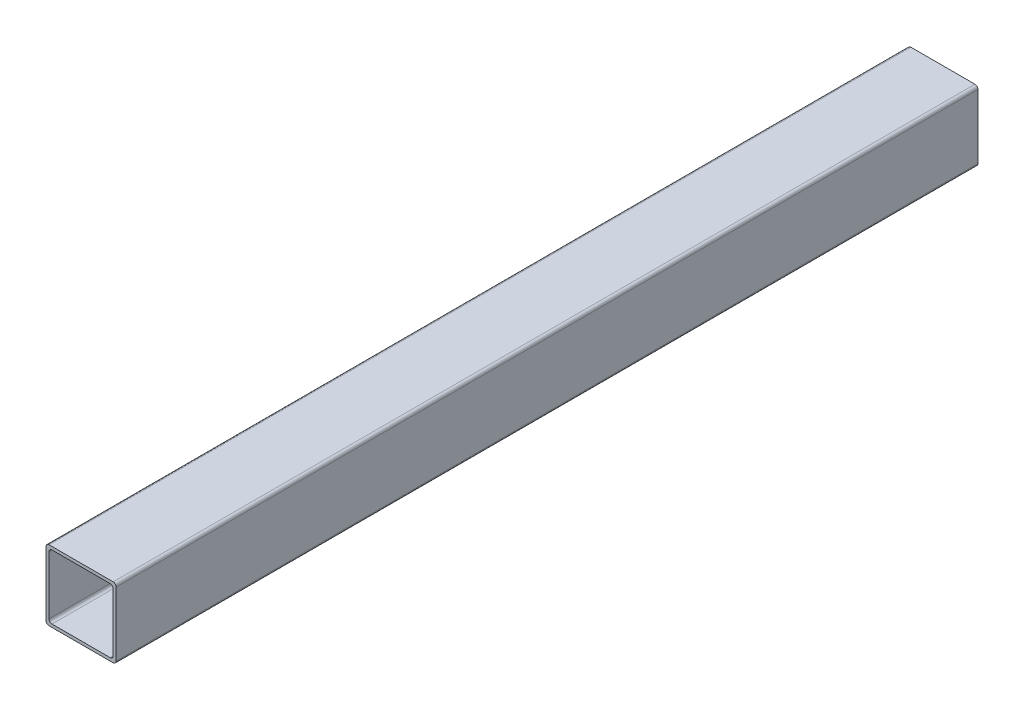
ISO-10303-21;
HEADER;
FILE_DESCRIPTION(('STEP AP214'),'2;1');
FILE_NAME('part.step','',(''),(''),'','','');
FILE_SCHEMA(('AUTOMOTIVE_DESIGN { 1 0 10303 214 1 1 1 1 }'));
ENDSEC;
DATA;
#1=APPLICATION_CONTEXT('core data for automotive mechanical design processes');
#2=APPLICATION_PROTOCOL_DEFINITION('international standard','automotive_design',2000,#1);
#3=PRODUCT_CONTEXT('',#1,'mechanical');
#4=PRODUCT('Part','Part','',(#3));
#5=PRODUCT_RELATED_PRODUCT_CATEGORY('part','',(#4));
#6=PRODUCT_DEFINITION_FORMATION('','',#4);
#7=PRODUCT_DEFINITION_CONTEXT('part definition',#1,'design');
#8=PRODUCT_DEFINITION('design','',#6,#7);
#9=PRODUCT_DEFINITION_SHAPE('','',#8);
#10=(LENGTH_UNIT() NAMED_UNIT(*) SI_UNIT(.MILLI.,.METRE.));
#11=(NAMED_UNIT(*) PLANE_ANGLE_UNIT() SI_UNIT($,.RADIAN.));
#12=(NAMED_UNIT(*) SI_UNIT($,.STERADIAN.) SOLID_ANGLE_UNIT());
#13=UNCERTAINTY_MEASURE_WITH_UNIT(LENGTH_MEASURE(1.E-05),#10,'distance_accuracy_value','');
#14=(GEOMETRIC_REPRESENTATION_CONTEXT(3) GLOBAL_UNCERTAINTY_ASSIGNED_CONTEXT((#13)) GLOBAL_UNIT_ASSIGNED_CONTEXT((#10,
#11,#12)) REPRESENTATION_CONTEXT('',''));
#15=CARTESIAN_POINT('',(0.,0.,0.));
#16=DIRECTION('',(0.,0.,1.));
#17=DIRECTION('',(1.,0.,0.));
#18=AXIS2_PLACEMENT_3D('',#15,#16,#17);
#19=CARTESIAN_POINT('',(0.,0.,860.));
#20=DIRECTION('',(0.,0.,-1.));
#21=DIRECTION('',(-1.,0.,0.));
#22=AXIS2_PLACEMENT_3D('',#19,#20,#21);
#23=PLANE('',#22);
#24=DIRECTION('',(1.,0.,0.));
#25=VECTOR('',#24,1.);
#26=CARTESIAN_POINT('',(0.,0.,860.));
#27=LINE('',#26,#25);
#28=CARTESIAN_POINT('',(3.,0.,860.));
#29=VERTEX_POINT('',#28);
#30=CARTESIAN_POINT('',(67.,0.,860.));
#31=VERTEX_POINT('',#30);
#32=EDGE_CURVE('E282',#29,#31,#27,.T.);
#33=ORIENTED_EDGE('',*,*,#32,.T.);
#34=CARTESIAN_POINT('',(67.,3.,860.));
#35=DIRECTION('',(0.,0.,-1.));
#36=DIRECTION('',(-1.,0.,0.));
#37=AXIS2_PLACEMENT_3D('',#34,#35,#36);
#38=CIRCLE('',#37,3.);
#39=CARTESIAN_POINT('',(70.,3.,860.));
#40=VERTEX_POINT('',#39);
#41=EDGE_CURVE('E203',#31,#40,#38,.F.);
#42=ORIENTED_EDGE('',*,*,#41,.T.);
#43=DIRECTION('',(0.,1.,0.));
#44=VECTOR('',#43,1.);
#45=CARTESIAN_POINT('',(70.,0.,860.));
#46=LINE('',#45,#44);
#47=CARTESIAN_POINT('',(70.,67.,860.));
#48=VERTEX_POINT('',#47);
#49=EDGE_CURVE('E171',#40,#48,#46,.T.);
#50=ORIENTED_EDGE('',*,*,#49,.T.);
#51=CARTESIAN_POINT('',(67.,67.,860.));
#52=DIRECTION('',(0.,0.,-1.));
#53=DIRECTION('',(-1.,0.,0.));
#54=AXIS2_PLACEMENT_3D('',#51,#52,#53);
#55=CIRCLE('',#54,3.);
#56=CARTESIAN_POINT('',(67.,70.,860.));
#57=VERTEX_POINT('',#56);
#58=EDGE_CURVE('E201',#48,#57,#55,.F.);
#59=ORIENTED_EDGE('',*,*,#58,.T.);
#60=DIRECTION('',(-1.,0.,0.));
#61=VECTOR('',#60,1.);
#62=CARTESIAN_POINT('',(0.,70.,860.));
#63=LINE('',#62,#61);
#64=CARTESIAN_POINT('',(3.,70.,860.));
#65=VERTEX_POINT('',#64);
#66=EDGE_CURVE('E188',#57,#65,#63,.T.);
#67=ORIENTED_EDGE('',*,*,#66,.T.);
#68=CARTESIAN_POINT('',(3.,67.,860.));
#69=DIRECTION('',(0.,0.,-1.));
#70=DIRECTION('',(-1.,0.,0.));
#71=AXIS2_PLACEMENT_3D('',#68,#69,#70);
#72=CIRCLE('',#71,3.);
#73=CARTESIAN_POINT('',(0.,67.,860.));
#74=VERTEX_POINT('',#73);
#75=EDGE_CURVE('E199',#65,#74,#72,.F.);
#76=ORIENTED_EDGE('',*,*,#75,.T.);
#77=DIRECTION('',(0.,-1.,0.));
#78=VECTOR('',#77,1.);
#79=CARTESIAN_POINT('',(0.,0.,860.));
#80=LINE('',#79,#78);
#81=CARTESIAN_POINT('',(0.,3.,860.));
#82=VERTEX_POINT('',#81);
#83=EDGE_CURVE('E182',#74,#82,#80,.T.);
#84=ORIENTED_EDGE('',*,*,#83,.T.);
#85=CARTESIAN_POINT('',(3.,3.,860.));
#86=DIRECTION('',(0.,0.,-1.));
#87=DIRECTION('',(-1.,0.,0.));
#88=AXIS2_PLACEMENT_3D('',#85,#86,#87);
#89=CIRCLE('',#88,3.);
#90=EDGE_CURVE('E197',#82,#29,#89,.F.);
#91=ORIENTED_EDGE('',*,*,#90,.T.);
#92=EDGE_LOOP('',(#33,#42,#50,#59,#67,#76,#84,#91));
#93=FACE_BOUND('',#92,.T.);
#94=DIRECTION('',(0.,-1.,0.));
#95=VECTOR('',#94,1.);
#96=CARTESIAN_POINT('',(3.,3.,860.));
#97=LINE('',#96,#95);
#98=CARTESIAN_POINT('',(3.,64.,860.));
#99=VERTEX_POINT('',#98);
#100=CARTESIAN_POINT('',(3.,6.,860.));
#101=VERTEX_POINT('',#100);
#102=EDGE_CURVE('E260',#99,#101,#97,.T.);
#103=ORIENTED_EDGE('',*,*,#102,.F.);
#104=CARTESIAN_POINT('',(6.,64.,860.));
#105=DIRECTION('',(0.,0.,-1.));
#106=DIRECTION('',(-1.,0.,0.));
#107=AXIS2_PLACEMENT_3D('',#104,#105,#106);
#108=CIRCLE('',#107,3.);
#109=CARTESIAN_POINT('',(6.,67.,860.));
#110=VERTEX_POINT('',#109);
#111=EDGE_CURVE('E243',#99,#110,#108,.T.);
#112=ORIENTED_EDGE('',*,*,#111,.T.);
#113=DIRECTION('',(-1.,0.,0.));
#114=VECTOR('',#113,1.);
#115=CARTESIAN_POINT('',(3.,67.,860.));
#116=LINE('',#115,#114);
#117=CARTESIAN_POINT('',(64.,67.,860.));
#118=VERTEX_POINT('',#117);
#119=EDGE_CURVE('E275',#118,#110,#116,.T.);
#120=ORIENTED_EDGE('',*,*,#119,.F.);
#121=CARTESIAN_POINT('',(64.,64.,860.));
#122=DIRECTION('',(0.,0.,-1.));
#123=DIRECTION('',(-1.,0.,0.));
#124=AXIS2_PLACEMENT_3D('',#121,#122,#123);
#125=CIRCLE('',#124,3.);
#126=CARTESIAN_POINT('',(67.,64.,860.));
#127=VERTEX_POINT('',#126);
#128=EDGE_CURVE('E239',#118,#127,#125,.T.);
#129=ORIENTED_EDGE('',*,*,#128,.T.);
#130=DIRECTION('',(0.,1.,0.));
#131=VECTOR('',#130,1.);
#132=CARTESIAN_POINT('',(67.,3.,860.));
#133=LINE('',#132,#131);
#134=CARTESIAN_POINT('',(67.,6.,860.));
#135=VERTEX_POINT('',#134);
#136=EDGE_CURVE('E268',#135,#127,#133,.T.);
#137=ORIENTED_EDGE('',*,*,#136,.F.);
#138=CARTESIAN_POINT('',(64.,6.,860.));
#139=DIRECTION('',(0.,0.,-1.));
#140=DIRECTION('',(-1.,0.,0.));
#141=AXIS2_PLACEMENT_3D('',#138,#139,#140);
#142=CIRCLE('',#141,3.);
#143=CARTESIAN_POINT('',(64.,3.,860.));
#144=VERTEX_POINT('',#143);
#145=EDGE_CURVE('E52',#135,#144,#142,.T.);
#146=ORIENTED_EDGE('',*,*,#145,.T.);
#147=DIRECTION('',(1.,0.,0.));
#148=VECTOR('',#147,1.);
#149=CARTESIAN_POINT('',(3.,3.,860.));
#150=LINE('',#149,#148);
#151=CARTESIAN_POINT('',(6.,3.,860.));
#152=VERTEX_POINT('',#151);
#153=EDGE_CURVE('E262',#152,#144,#150,.T.);
#154=ORIENTED_EDGE('',*,*,#153,.F.);
#155=CARTESIAN_POINT('',(6.,6.,860.));
#156=DIRECTION('',(0.,0.,-1.));
#157=DIRECTION('',(-1.,0.,0.));
#158=AXIS2_PLACEMENT_3D('',#155,#156,#157);
#159=CIRCLE('',#158,3.);
#160=EDGE_CURVE('E11',#152,#101,#159,.T.);
#161=ORIENTED_EDGE('',*,*,#160,.T.);
#162=EDGE_LOOP('',(#103,#112,#120,#129,#137,#146,#154,#161));
#163=FACE_BOUND('',#162,.T.);
#164=ADVANCED_FACE('F37',(#93,#163),#23,.F.);
#165=CARTESIAN_POINT('',(0.,0.,0.));
#166=DIRECTION('',(0.,0.,-1.));
#167=DIRECTION('',(-1.,0.,0.));
#168=AXIS2_PLACEMENT_3D('',#165,#166,#167);
#169=PLANE('',#168);
#170=DIRECTION('',(0.,1.,0.));
#171=VECTOR('',#170,1.);
#172=CARTESIAN_POINT('',(70.,0.,0.));
#173=LINE('',#172,#171);
#174=CARTESIAN_POINT('',(70.,3.,0.));
#175=VERTEX_POINT('',#174);
#176=CARTESIAN_POINT('',(70.,67.,0.));
#177=VERTEX_POINT('',#176);
#178=EDGE_CURVE('E168',#175,#177,#173,.T.);
#179=ORIENTED_EDGE('',*,*,#178,.F.);
#180=CARTESIAN_POINT('',(67.,3.,0.));
#181=DIRECTION('',(0.,0.,-1.));
#182=DIRECTION('',(-1.,0.,0.));
#183=AXIS2_PLACEMENT_3D('',#180,#181,#182);
#184=CIRCLE('',#183,3.);
#185=CARTESIAN_POINT('',(67.,0.,0.));
#186=VERTEX_POINT('',#185);
#187=EDGE_CURVE('E151',#175,#186,#184,.T.);
#188=ORIENTED_EDGE('',*,*,#187,.T.);
#189=DIRECTION('',(1.,0.,0.));
#190=VECTOR('',#189,1.);
#191=CARTESIAN_POINT('',(0.,0.,0.));
#192=LINE('',#191,#190);
#193=CARTESIAN_POINT('',(3.,0.,0.));
#194=VERTEX_POINT('',#193);
#195=EDGE_CURVE('E179',#194,#186,#192,.T.);
#196=ORIENTED_EDGE('',*,*,#195,.F.);
#197=CARTESIAN_POINT('',(3.,3.,0.));
#198=DIRECTION('',(0.,0.,-1.));
#199=DIRECTION('',(-1.,0.,0.));
#200=AXIS2_PLACEMENT_3D('',#197,#198,#199);
#201=CIRCLE('',#200,3.);
#202=CARTESIAN_POINT('',(0.,3.,0.));
#203=VERTEX_POINT('',#202);
#204=EDGE_CURVE('E172',#194,#203,#201,.T.);
#205=ORIENTED_EDGE('',*,*,#204,.T.);
#206=DIRECTION('',(0.,-1.,0.));
#207=VECTOR('',#206,1.);
#208=CARTESIAN_POINT('',(0.,0.,0.));
#209=LINE('',#208,#207);
#210=CARTESIAN_POINT('',(0.,67.,0.));
#211=VERTEX_POINT('',#210);
#212=EDGE_CURVE('E184',#211,#203,#209,.T.);
#213=ORIENTED_EDGE('',*,*,#212,.F.);
#214=CARTESIAN_POINT('',(3.,67.,0.));
#215=DIRECTION('',(0.,0.,-1.));
#216=DIRECTION('',(-1.,0.,0.));
#217=AXIS2_PLACEMENT_3D('',#214,#215,#216);
#218=CIRCLE('',#217,3.);
#219=CARTESIAN_POINT('',(3.,70.,0.));
#220=VERTEX_POINT('',#219);
#221=EDGE_CURVE('E191',#211,#220,#218,.T.);
#222=ORIENTED_EDGE('',*,*,#221,.T.);
#223=DIRECTION('',(-1.,0.,0.));
#224=VECTOR('',#223,1.);
#225=CARTESIAN_POINT('',(0.,70.,0.));
#226=LINE('',#225,#224);
#227=CARTESIAN_POINT('',(67.,70.,0.));
#228=VERTEX_POINT('',#227);
#229=EDGE_CURVE('E178',#228,#220,#226,.T.);
#230=ORIENTED_EDGE('',*,*,#229,.F.);
#231=CARTESIAN_POINT('',(67.,67.,0.));
#232=DIRECTION('',(0.,0.,-1.));
#233=DIRECTION('',(-1.,0.,0.));
#234=AXIS2_PLACEMENT_3D('',#231,#232,#233);
#235=CIRCLE('',#234,3.);
#236=EDGE_CURVE('E162',#228,#177,#235,.T.);
#237=ORIENTED_EDGE('',*,*,#236,.T.);
#238=EDGE_LOOP('',(#179,#188,#196,#205,#213,#222,#230,#237));
#239=FACE_BOUND('',#238,.T.);
#240=DIRECTION('',(0.,1.,0.));
#241=VECTOR('',#240,1.);
#242=CARTESIAN_POINT('',(67.,3.,0.));
#243=LINE('',#242,#241);
#244=CARTESIAN_POINT('',(67.,6.,0.));
#245=VERTEX_POINT('',#244);
#246=CARTESIAN_POINT('',(67.,64.,0.));
#247=VERTEX_POINT('',#246);
#248=EDGE_CURVE('E254',#245,#247,#243,.T.);
#249=ORIENTED_EDGE('',*,*,#248,.T.);
#250=CARTESIAN_POINT('',(64.,64.,0.));
#251=DIRECTION('',(0.,0.,-1.));
#252=DIRECTION('',(-1.,0.,0.));
#253=AXIS2_PLACEMENT_3D('',#250,#251,#252);
#254=CIRCLE('',#253,3.);
#255=CARTESIAN_POINT('',(64.,67.,0.));
#256=VERTEX_POINT('',#255);
#257=EDGE_CURVE('E237',#247,#256,#254,.F.);
#258=ORIENTED_EDGE('',*,*,#257,.T.);
#259=DIRECTION('',(-1.,0.,0.));
#260=VECTOR('',#259,1.);
#261=CARTESIAN_POINT('',(3.,67.,0.));
#262=LINE('',#261,#260);
#263=CARTESIAN_POINT('',(6.,67.,0.));
#264=VERTEX_POINT('',#263);
#265=EDGE_CURVE('E266',#256,#264,#262,.T.);
#266=ORIENTED_EDGE('',*,*,#265,.T.);
#267=CARTESIAN_POINT('',(6.,64.,0.));
#268=DIRECTION('',(0.,0.,-1.));
#269=DIRECTION('',(-1.,0.,0.));
#270=AXIS2_PLACEMENT_3D('',#267,#268,#269);
#271=CIRCLE('',#270,3.);
#272=CARTESIAN_POINT('',(3.,64.,0.));
#273=VERTEX_POINT('',#272);
#274=EDGE_CURVE('E241',#264,#273,#271,.F.);
#275=ORIENTED_EDGE('',*,*,#274,.T.);
#276=DIRECTION('',(0.,-1.,0.));
#277=VECTOR('',#276,1.);
#278=CARTESIAN_POINT('',(3.,3.,0.));
#279=LINE('',#278,#277);
#280=CARTESIAN_POINT('',(3.,6.,0.));
#281=VERTEX_POINT('',#280);
#282=EDGE_CURVE('E249',#273,#281,#279,.T.);
#283=ORIENTED_EDGE('',*,*,#282,.T.);
#284=CARTESIAN_POINT('',(6.,6.,0.));
#285=DIRECTION('',(0.,0.,-1.));
#286=DIRECTION('',(-1.,0.,0.));
#287=AXIS2_PLACEMENT_3D('',#284,#285,#286);
#288=CIRCLE('',#287,3.);
#289=CARTESIAN_POINT('',(6.,3.,0.));
#290=VERTEX_POINT('',#289);
#291=EDGE_CURVE('E45',#281,#290,#288,.F.);
#292=ORIENTED_EDGE('',*,*,#291,.T.);
#293=DIRECTION('',(1.,0.,0.));
#294=VECTOR('',#293,1.);
#295=CARTESIAN_POINT('',(3.,3.,0.));
#296=LINE('',#295,#294);
#297=CARTESIAN_POINT('',(64.,3.,0.));
#298=VERTEX_POINT('',#297);
#299=EDGE_CURVE('E247',#290,#298,#296,.T.);
#300=ORIENTED_EDGE('',*,*,#299,.T.);
#301=CARTESIAN_POINT('',(64.,6.,0.));
#302=DIRECTION('',(0.,0.,-1.));
#303=DIRECTION('',(-1.,0.,0.));
#304=AXIS2_PLACEMENT_3D('',#301,#302,#303);
#305=CIRCLE('',#304,3.);
#306=EDGE_CURVE('E234',#298,#245,#305,.F.);
#307=ORIENTED_EDGE('',*,*,#306,.T.);
#308=EDGE_LOOP('',(#249,#258,#266,#275,#283,#292,#300,#307));
#309=FACE_BOUND('',#308,.T.);
#310=ADVANCED_FACE('F175',(#239,#309),#169,.T.);
#311=CARTESIAN_POINT('',(0.,0.,860.));
#312=DIRECTION('',(1.,0.,0.));
#313=DIRECTION('',(0.,0.,-1.));
#314=AXIS2_PLACEMENT_3D('',#311,#312,#313);
#315=PLANE('',#314);
#316=ORIENTED_EDGE('',*,*,#83,.F.);
#317=DIRECTION('',(0.,0.,-1.));
#318=VECTOR('',#317,1.);
#319=CARTESIAN_POINT('',(0.,67.,860.));
#320=LINE('',#319,#318);
#321=EDGE_CURVE('E226',#74,#211,#320,.T.);
#322=ORIENTED_EDGE('',*,*,#321,.T.);
#323=ORIENTED_EDGE('',*,*,#212,.T.);
#324=DIRECTION('',(0.,0.,-1.));
#325=VECTOR('',#324,1.);
#326=CARTESIAN_POINT('',(0.,3.,860.));
#327=LINE('',#326,#325);
#328=EDGE_CURVE('E224',#203,#82,#327,.F.);
#329=ORIENTED_EDGE('',*,*,#328,.T.);
#330=EDGE_LOOP('',(#316,#322,#323,#329));
#331=FACE_BOUND('',#330,.T.);
#332=ADVANCED_FACE('F292',(#331),#315,.F.);
#333=CARTESIAN_POINT('',(0.,0.,860.));
#334=DIRECTION('',(0.,1.,0.));
#335=DIRECTION('',(0.,0.,1.));
#336=AXIS2_PLACEMENT_3D('',#333,#334,#335);
#337=PLANE('',#336);
#338=ORIENTED_EDGE('',*,*,#195,.T.);
#339=DIRECTION('',(0.,0.,-1.));
#340=VECTOR('',#339,1.);
#341=CARTESIAN_POINT('',(67.,0.,860.));
#342=LINE('',#341,#340);
#343=EDGE_CURVE('E156',#186,#31,#342,.F.);
#344=ORIENTED_EDGE('',*,*,#343,.T.);
#345=ORIENTED_EDGE('',*,*,#32,.F.);
#346=DIRECTION('',(0.,0.,-1.));
#347=VECTOR('',#346,1.);
#348=CARTESIAN_POINT('',(3.,0.,860.));
#349=LINE('',#348,#347);
#350=EDGE_CURVE('E161',#29,#194,#349,.T.);
#351=ORIENTED_EDGE('',*,*,#350,.T.);
#352=EDGE_LOOP('',(#338,#344,#345,#351));
#353=FACE_BOUND('',#352,.T.);
#354=ADVANCED_FACE('F300',(#353),#337,.F.);
#355=CARTESIAN_POINT('',(70.,0.,860.));
#356=DIRECTION('',(-1.,0.,0.));
#357=DIRECTION('',(0.,0.,1.));
#358=AXIS2_PLACEMENT_3D('',#355,#356,#357);
#359=PLANE('',#358);
#360=ORIENTED_EDGE('',*,*,#49,.F.);
#361=DIRECTION('',(0.,0.,-1.));
#362=VECTOR('',#361,1.);
#363=CARTESIAN_POINT('',(70.,3.,860.));
#364=LINE('',#363,#362);
#365=EDGE_CURVE('E155',#40,#175,#364,.T.);
#366=ORIENTED_EDGE('',*,*,#365,.T.);
#367=ORIENTED_EDGE('',*,*,#178,.T.);
#368=DIRECTION('',(0.,0.,-1.));
#369=VECTOR('',#368,1.);
#370=CARTESIAN_POINT('',(70.,67.,860.));
#371=LINE('',#370,#369);
#372=EDGE_CURVE('E173',#177,#48,#371,.F.);
#373=ORIENTED_EDGE('',*,*,#372,.T.);
#374=EDGE_LOOP('',(#360,#366,#367,#373));
#375=FACE_BOUND('',#374,.T.);
#376=ADVANCED_FACE('F167',(#375),#359,.F.);
#377=CARTESIAN_POINT('',(0.,70.,860.));
#378=DIRECTION('',(0.,-1.,0.));
#379=DIRECTION('',(0.,0.,-1.));
#380=AXIS2_PLACEMENT_3D('',#377,#378,#379);
#381=PLANE('',#380);
#382=ORIENTED_EDGE('',*,*,#66,.F.);
#383=DIRECTION('',(0.,0.,-1.));
#384=VECTOR('',#383,1.);
#385=CARTESIAN_POINT('',(67.,70.,860.));
#386=LINE('',#385,#384);
#387=EDGE_CURVE('E216',#57,#228,#386,.T.);
#388=ORIENTED_EDGE('',*,*,#387,.T.);
#389=ORIENTED_EDGE('',*,*,#229,.T.);
#390=DIRECTION('',(0.,0.,-1.));
#391=VECTOR('',#390,1.);
#392=CARTESIAN_POINT('',(3.,70.,860.));
#393=LINE('',#392,#391);
#394=EDGE_CURVE('E214',#220,#65,#393,.F.);
#395=ORIENTED_EDGE('',*,*,#394,.T.);
#396=EDGE_LOOP('',(#382,#388,#389,#395));
#397=FACE_BOUND('',#396,.T.);
#398=ADVANCED_FACE('F307',(#397),#381,.F.);
#399=CARTESIAN_POINT('',(3.,3.,860.));
#400=DIRECTION('',(1.,0.,0.));
#401=DIRECTION('',(0.,0.,-1.));
#402=AXIS2_PLACEMENT_3D('',#399,#400,#401);
#403=PLANE('',#402);
#404=ORIENTED_EDGE('',*,*,#282,.F.);
#405=DIRECTION('',(0.,0.,-1.));
#406=VECTOR('',#405,1.);
#407=CARTESIAN_POINT('',(3.,64.,860.));
#408=LINE('',#407,#406);
#409=EDGE_CURVE('E232',#273,#99,#408,.F.);
#410=ORIENTED_EDGE('',*,*,#409,.T.);
#411=ORIENTED_EDGE('',*,*,#102,.T.);
#412=DIRECTION('',(0.,0.,-1.));
#413=VECTOR('',#412,1.);
#414=CARTESIAN_POINT('',(3.,6.,0.));
#415=LINE('',#414,#413);
#416=EDGE_CURVE('E229',#101,#281,#415,.T.);
#417=ORIENTED_EDGE('',*,*,#416,.T.);
#418=EDGE_LOOP('',(#404,#410,#411,#417));
#419=FACE_BOUND('',#418,.T.);
#420=ADVANCED_FACE('F264',(#419),#403,.T.);
#421=CARTESIAN_POINT('',(3.,3.,860.));
#422=DIRECTION('',(0.,1.,0.));
#423=DIRECTION('',(0.,0.,1.));
#424=AXIS2_PLACEMENT_3D('',#421,#422,#423);
#425=PLANE('',#424);
#426=ORIENTED_EDGE('',*,*,#153,.T.);
#427=DIRECTION('',(0.,0.,-1.));
#428=VECTOR('',#427,1.);
#429=CARTESIAN_POINT('',(64.,3.,0.));
#430=LINE('',#429,#428);
#431=EDGE_CURVE('E206',#144,#298,#430,.T.);
#432=ORIENTED_EDGE('',*,*,#431,.T.);
#433=ORIENTED_EDGE('',*,*,#299,.F.);
#434=DIRECTION('',(0.,0.,-1.));
#435=VECTOR('',#434,1.);
#436=CARTESIAN_POINT('',(6.,3.,860.));
#437=LINE('',#436,#435);
#438=EDGE_CURVE('E59',#290,#152,#437,.F.);
#439=ORIENTED_EDGE('',*,*,#438,.T.);
#440=EDGE_LOOP('',(#426,#432,#433,#439));
#441=FACE_BOUND('',#440,.T.);
#442=ADVANCED_FACE('F252',(#441),#425,.T.);
#443=CARTESIAN_POINT('',(67.,3.,860.));
#444=DIRECTION('',(-1.,0.,0.));
#445=DIRECTION('',(0.,0.,1.));
#446=AXIS2_PLACEMENT_3D('',#443,#444,#445);
#447=PLANE('',#446);
#448=ORIENTED_EDGE('',*,*,#248,.F.);
#449=DIRECTION('',(0.,0.,-1.));
#450=VECTOR('',#449,1.);
#451=CARTESIAN_POINT('',(67.,6.,860.));
#452=LINE('',#451,#450);
#453=EDGE_CURVE('E212',#245,#135,#452,.F.);
#454=ORIENTED_EDGE('',*,*,#453,.T.);
#455=ORIENTED_EDGE('',*,*,#136,.T.);
#456=DIRECTION('',(0.,0.,-1.));
#457=VECTOR('',#456,1.);
#458=CARTESIAN_POINT('',(67.,64.,0.));
#459=LINE('',#458,#457);
#460=EDGE_CURVE('E209',#127,#247,#459,.T.);
#461=ORIENTED_EDGE('',*,*,#460,.T.);
#462=EDGE_LOOP('',(#448,#454,#455,#461));
#463=FACE_BOUND('',#462,.T.);
#464=ADVANCED_FACE('F415',(#463),#447,.T.);
#465=CARTESIAN_POINT('',(3.,67.,860.));
#466=DIRECTION('',(0.,-1.,0.));
#467=DIRECTION('',(0.,0.,-1.));
#468=AXIS2_PLACEMENT_3D('',#465,#466,#467);
#469=PLANE('',#468);
#470=ORIENTED_EDGE('',*,*,#265,.F.);
#471=DIRECTION('',(0.,0.,-1.));
#472=VECTOR('',#471,1.);
#473=CARTESIAN_POINT('',(64.,67.,860.));
#474=LINE('',#473,#472);
#475=EDGE_CURVE('E222',#256,#118,#474,.F.);
#476=ORIENTED_EDGE('',*,*,#475,.T.);
#477=ORIENTED_EDGE('',*,*,#119,.T.);
#478=DIRECTION('',(0.,0.,-1.));
#479=VECTOR('',#478,1.);
#480=CARTESIAN_POINT('',(6.,67.,0.));
#481=LINE('',#480,#479);
#482=EDGE_CURVE('E219',#110,#264,#481,.T.);
#483=ORIENTED_EDGE('',*,*,#482,.T.);
#484=EDGE_LOOP('',(#470,#476,#477,#483));
#485=FACE_BOUND('',#484,.T.);
#486=ADVANCED_FACE('F406',(#485),#469,.T.);
#487=CARTESIAN_POINT('',(67.,3.,860.));
#488=DIRECTION('',(0.,0.,-1.));
#489=DIRECTION('',(-1.,0.,0.));
#490=AXIS2_PLACEMENT_3D('',#487,#488,#489);
#491=CYLINDRICAL_SURFACE('',#490,3.);
#492=ORIENTED_EDGE('',*,*,#41,.F.);
#493=ORIENTED_EDGE('',*,*,#343,.F.);
#494=ORIENTED_EDGE('',*,*,#187,.F.);
#495=ORIENTED_EDGE('',*,*,#365,.F.);
#496=EDGE_LOOP('',(#492,#493,#494,#495));
#497=FACE_BOUND('',#496,.T.);
#498=ADVANCED_FACE('F154',(#497),#491,.T.);
#499=CARTESIAN_POINT('',(64.,6.,860.));
#500=DIRECTION('',(0.,0.,1.));
#501=DIRECTION('',(1.,0.,0.));
#502=AXIS2_PLACEMENT_3D('',#499,#500,#501);
#503=CYLINDRICAL_SURFACE('',#502,3.);
#504=ORIENTED_EDGE('',*,*,#145,.F.);
#505=ORIENTED_EDGE('',*,*,#453,.F.);
#506=ORIENTED_EDGE('',*,*,#306,.F.);
#507=ORIENTED_EDGE('',*,*,#431,.F.);
#508=EDGE_LOOP('',(#504,#505,#506,#507));
#509=FACE_BOUND('',#508,.T.);
#510=ADVANCED_FACE('F333',(#509),#503,.F.);
#511=CARTESIAN_POINT('',(67.,67.,860.));
#512=DIRECTION('',(0.,0.,-1.));
#513=DIRECTION('',(-1.,0.,0.));
#514=AXIS2_PLACEMENT_3D('',#511,#512,#513);
#515=CYLINDRICAL_SURFACE('',#514,3.);
#516=ORIENTED_EDGE('',*,*,#58,.F.);
#517=ORIENTED_EDGE('',*,*,#372,.F.);
#518=ORIENTED_EDGE('',*,*,#236,.F.);
#519=ORIENTED_EDGE('',*,*,#387,.F.);
#520=EDGE_LOOP('',(#516,#517,#518,#519));
#521=FACE_BOUND('',#520,.T.);
#522=ADVANCED_FACE('F330',(#521),#515,.T.);
#523=CARTESIAN_POINT('',(64.,64.,860.));
#524=DIRECTION('',(0.,0.,1.));
#525=DIRECTION('',(1.,0.,0.));
#526=AXIS2_PLACEMENT_3D('',#523,#524,#525);
#527=CYLINDRICAL_SURFACE('',#526,3.);
#528=ORIENTED_EDGE('',*,*,#128,.F.);
#529=ORIENTED_EDGE('',*,*,#475,.F.);
#530=ORIENTED_EDGE('',*,*,#257,.F.);
#531=ORIENTED_EDGE('',*,*,#460,.F.);
#532=EDGE_LOOP('',(#528,#529,#530,#531));
#533=FACE_BOUND('',#532,.T.);
#534=ADVANCED_FACE('F332',(#533),#527,.F.);
#535=CARTESIAN_POINT('',(3.,67.,860.));
#536=DIRECTION('',(0.,0.,-1.));
#537=DIRECTION('',(-1.,0.,0.));
#538=AXIS2_PLACEMENT_3D('',#535,#536,#537);
#539=CYLINDRICAL_SURFACE('',#538,3.);
#540=ORIENTED_EDGE('',*,*,#75,.F.);
#541=ORIENTED_EDGE('',*,*,#394,.F.);
#542=ORIENTED_EDGE('',*,*,#221,.F.);
#543=ORIENTED_EDGE('',*,*,#321,.F.);
#544=EDGE_LOOP('',(#540,#541,#542,#543));
#545=FACE_BOUND('',#544,.T.);
#546=ADVANCED_FACE('F339',(#545),#539,.T.);
#547=CARTESIAN_POINT('',(6.,64.,860.));
#548=DIRECTION('',(0.,0.,1.));
#549=DIRECTION('',(1.,0.,0.));
#550=AXIS2_PLACEMENT_3D('',#547,#548,#549);
#551=CYLINDRICAL_SURFACE('',#550,3.);
#552=ORIENTED_EDGE('',*,*,#111,.F.);
#553=ORIENTED_EDGE('',*,*,#409,.F.);
#554=ORIENTED_EDGE('',*,*,#274,.F.);
#555=ORIENTED_EDGE('',*,*,#482,.F.);
#556=EDGE_LOOP('',(#552,#553,#554,#555));
#557=FACE_BOUND('',#556,.T.);
#558=ADVANCED_FACE('F348',(#557),#551,.F.);
#559=CARTESIAN_POINT('',(6.,6.,860.));
#560=DIRECTION('',(0.,0.,1.));
#561=DIRECTION('',(1.,0.,0.));
#562=AXIS2_PLACEMENT_3D('',#559,#560,#561);
#563=CYLINDRICAL_SURFACE('',#562,3.);
#564=ORIENTED_EDGE('',*,*,#160,.F.);
#565=ORIENTED_EDGE('',*,*,#438,.F.);
#566=ORIENTED_EDGE('',*,*,#291,.F.);
#567=ORIENTED_EDGE('',*,*,#416,.F.);
#568=EDGE_LOOP('',(#564,#565,#566,#567));
#569=FACE_BOUND('',#568,.T.);
#570=ADVANCED_FACE('F257',(#569),#563,.F.);
#571=CARTESIAN_POINT('',(3.,3.,860.));
#572=DIRECTION('',(0.,0.,-1.));
#573=DIRECTION('',(-1.,0.,0.));
#574=AXIS2_PLACEMENT_3D('',#571,#572,#573);
#575=CYLINDRICAL_SURFACE('',#574,3.);
#576=ORIENTED_EDGE('',*,*,#90,.F.);
#577=ORIENTED_EDGE('',*,*,#328,.F.);
#578=ORIENTED_EDGE('',*,*,#204,.F.);
#579=ORIENTED_EDGE('',*,*,#350,.F.);
#580=EDGE_LOOP('',(#576,#577,#578,#579));
#581=FACE_BOUND('',#580,.T.);
#582=ADVANCED_FACE('F39',(#581),#575,.T.);
#583=CLOSED_SHELL('',(#164,#310,#332,#354,#376,#398,#420,#442,#464,#486,#498,#510,#522,#534,
#546,#558,#570,#582));
#584=MANIFOLD_SOLID_BREP('B2',#583);
#585=ADVANCED_BREP_SHAPE_REPRESENTATION('',(#18,#584),#14);
#586=SHAPE_DEFINITION_REPRESENTATION(#9,#585);
ENDSEC;
END-ISO-10303-21;
